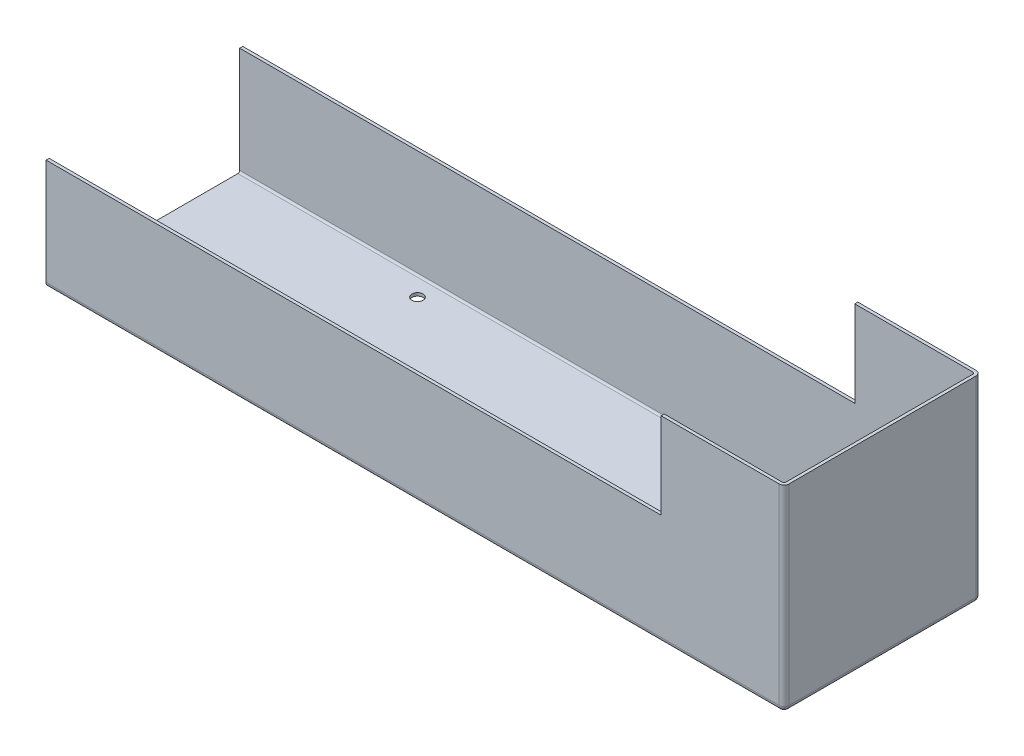
ISO-10303-21;
HEADER;
FILE_DESCRIPTION(('STEP AP214'),'2;1');
FILE_NAME('part.step','',(''),(''),'','','');
FILE_SCHEMA(('AUTOMOTIVE_DESIGN { 1 0 10303 214 1 1 1 1 }'));
ENDSEC;
DATA;
#1=APPLICATION_CONTEXT('core data for automotive mechanical design processes');
#2=APPLICATION_PROTOCOL_DEFINITION('international standard','automotive_design',2000,#1);
#3=PRODUCT_CONTEXT('',#1,'mechanical');
#4=PRODUCT('Part','Part','',(#3));
#5=PRODUCT_RELATED_PRODUCT_CATEGORY('part','',(#4));
#6=PRODUCT_DEFINITION_FORMATION('','',#4);
#7=PRODUCT_DEFINITION_CONTEXT('part definition',#1,'design');
#8=PRODUCT_DEFINITION('design','',#6,#7);
#9=PRODUCT_DEFINITION_SHAPE('','',#8);
#10=(LENGTH_UNIT() NAMED_UNIT(*) SI_UNIT(.MILLI.,.METRE.));
#11=(NAMED_UNIT(*) PLANE_ANGLE_UNIT() SI_UNIT($,.RADIAN.));
#12=(NAMED_UNIT(*) SI_UNIT($,.STERADIAN.) SOLID_ANGLE_UNIT());
#13=UNCERTAINTY_MEASURE_WITH_UNIT(LENGTH_MEASURE(1.E-05),#10,'distance_accuracy_value','');
#14=(GEOMETRIC_REPRESENTATION_CONTEXT(3) GLOBAL_UNCERTAINTY_ASSIGNED_CONTEXT((#13)) GLOBAL_UNIT_ASSIGNED_CONTEXT((#10,
#11,#12)) REPRESENTATION_CONTEXT('',''));
#15=CARTESIAN_POINT('',(0.,0.,0.));
#16=DIRECTION('',(0.,0.,1.));
#17=DIRECTION('',(1.,0.,0.));
#18=AXIS2_PLACEMENT_3D('',#15,#16,#17);
#19=CARTESIAN_POINT('',(298.,2.,38.));
#20=DIRECTION('',(1.,0.,0.));
#21=DIRECTION('',(0.,0.,-1.));
#22=AXIS2_PLACEMENT_3D('',#19,#20,#21);
#23=SPHERICAL_SURFACE('',#22,0.75);
#24=CARTESIAN_POINT('',(298.,2.,38.));
#25=DIRECTION('',(0.,0.,-1.));
#26=DIRECTION('',(-1.,0.,0.));
#27=AXIS2_PLACEMENT_3D('',#24,#25,#26);
#28=CIRCLE('',#27,0.749999999999973);
#29=CARTESIAN_POINT('',(298.75,2.,38.));
#30=VERTEX_POINT('',#29);
#31=CARTESIAN_POINT('',(298.,1.25000000000001,38.));
#32=VERTEX_POINT('',#31);
#33=EDGE_CURVE('E361',#30,#32,#28,.T.);
#34=ORIENTED_EDGE('',*,*,#33,.T.);
#35=CARTESIAN_POINT('',(298.,2.,38.));
#36=DIRECTION('',(-1.,0.,0.));
#37=DIRECTION('',(0.,0.,1.));
#38=AXIS2_PLACEMENT_3D('',#35,#36,#37);
#39=CIRCLE('',#38,0.750000000000001);
#40=CARTESIAN_POINT('',(298.,2.00000000000001,38.75));
#41=VERTEX_POINT('',#40);
#42=EDGE_CURVE('E112',#32,#41,#39,.T.);
#43=ORIENTED_EDGE('',*,*,#42,.T.);
#44=CARTESIAN_POINT('',(298.,2.,38.));
#45=DIRECTION('',(0.,-1.,0.));
#46=DIRECTION('',(0.,0.,-1.));
#47=AXIS2_PLACEMENT_3D('',#44,#45,#46);
#48=CIRCLE('',#47,0.750000000000001);
#49=EDGE_CURVE('E358',#41,#30,#48,.F.);
#50=ORIENTED_EDGE('',*,*,#49,.T.);
#51=EDGE_LOOP('',(#34,#43,#50));
#52=FACE_BOUND('',#51,.T.);
#53=ADVANCED_FACE('F16',(#52),#23,.F.);
#54=CARTESIAN_POINT('',(298.75,0.,40.));
#55=DIRECTION('',(-1.,0.,0.));
#56=DIRECTION('',(0.,0.,1.));
#57=AXIS2_PLACEMENT_3D('',#54,#55,#56);
#58=PLANE('',#57);
#59=DIRECTION('',(0.,0.,-1.));
#60=VECTOR('',#59,1.);
#61=CARTESIAN_POINT('',(298.75,2.,40.));
#62=LINE('',#61,#60);
#63=CARTESIAN_POINT('',(298.75,2.,-38.));
#64=VERTEX_POINT('',#63);
#65=EDGE_CURVE('E370',#64,#30,#62,.F.);
#66=ORIENTED_EDGE('',*,*,#65,.T.);
#67=DIRECTION('',(0.,-1.,0.));
#68=VECTOR('',#67,1.);
#69=CARTESIAN_POINT('',(298.75,0.,38.));
#70=LINE('',#69,#68);
#71=CARTESIAN_POINT('',(298.75,80.,38.));
#72=VERTEX_POINT('',#71);
#73=EDGE_CURVE('E342',#30,#72,#70,.F.);
#74=ORIENTED_EDGE('',*,*,#73,.T.);
#75=DIRECTION('',(0.,0.,-1.));
#76=VECTOR('',#75,1.);
#77=CARTESIAN_POINT('',(298.75,80.,40.));
#78=LINE('',#77,#76);
#79=CARTESIAN_POINT('',(298.75,80.,-38.));
#80=VERTEX_POINT('',#79);
#81=EDGE_CURVE('E307',#72,#80,#78,.T.);
#82=ORIENTED_EDGE('',*,*,#81,.T.);
#83=DIRECTION('',(0.,1.,0.));
#84=VECTOR('',#83,1.);
#85=CARTESIAN_POINT('',(298.75,0.,-38.));
#86=LINE('',#85,#84);
#87=EDGE_CURVE('E275',#80,#64,#86,.F.);
#88=ORIENTED_EDGE('',*,*,#87,.T.);
#89=EDGE_LOOP('',(#66,#74,#82,#88));
#90=FACE_BOUND('',#89,.T.);
#91=ADVANCED_FACE('F390',(#90),#58,.T.);
#92=CARTESIAN_POINT('',(298.,2.,-38.));
#93=DIRECTION('',(1.,0.,0.));
#94=DIRECTION('',(0.,0.,-1.));
#95=AXIS2_PLACEMENT_3D('',#92,#93,#94);
#96=SPHERICAL_SURFACE('',#95,0.75);
#97=CARTESIAN_POINT('',(298.,2.,-38.));
#98=DIRECTION('',(0.,0.,-1.));
#99=DIRECTION('',(-1.,0.,0.));
#100=AXIS2_PLACEMENT_3D('',#97,#98,#99);
#101=CIRCLE('',#100,0.749999999999973);
#102=CARTESIAN_POINT('',(298.,1.25000000000001,-38.));
#103=VERTEX_POINT('',#102);
#104=EDGE_CURVE('E367',#103,#64,#101,.F.);
#105=ORIENTED_EDGE('',*,*,#104,.T.);
#106=CARTESIAN_POINT('',(298.,2.,-38.));
#107=DIRECTION('',(0.,1.,0.));
#108=DIRECTION('',(0.,0.,1.));
#109=AXIS2_PLACEMENT_3D('',#106,#107,#108);
#110=CIRCLE('',#109,0.750000000000001);
#111=CARTESIAN_POINT('',(298.,2.00000000000001,-38.75));
#112=VERTEX_POINT('',#111);
#113=EDGE_CURVE('E272',#64,#112,#110,.T.);
#114=ORIENTED_EDGE('',*,*,#113,.T.);
#115=CARTESIAN_POINT('',(298.,2.,-38.));
#116=DIRECTION('',(1.,0.,0.));
#117=DIRECTION('',(0.,0.,-1.));
#118=AXIS2_PLACEMENT_3D('',#115,#116,#117);
#119=CIRCLE('',#118,0.750000000000001);
#120=EDGE_CURVE('E265',#112,#103,#119,.F.);
#121=ORIENTED_EDGE('',*,*,#120,.T.);
#122=EDGE_LOOP('',(#105,#114,#121));
#123=FACE_BOUND('',#122,.T.);
#124=ADVANCED_FACE('F386',(#123),#96,.F.);
#125=CARTESIAN_POINT('',(298.,2.,40.));
#126=DIRECTION('',(0.,0.,-1.));
#127=DIRECTION('',(-1.,0.,0.));
#128=AXIS2_PLACEMENT_3D('',#125,#126,#127);
#129=CYLINDRICAL_SURFACE('',#128,0.749999999999973);
#130=ORIENTED_EDGE('',*,*,#65,.F.);
#131=ORIENTED_EDGE('',*,*,#104,.F.);
#132=DIRECTION('',(0.,0.,1.));
#133=VECTOR('',#132,1.);
#134=CARTESIAN_POINT('',(298.,1.25,40.));
#135=LINE('',#134,#133);
#136=EDGE_CURVE('E121',#32,#103,#135,.F.);
#137=ORIENTED_EDGE('',*,*,#136,.F.);
#138=ORIENTED_EDGE('',*,*,#33,.F.);
#139=EDGE_LOOP('',(#130,#131,#137,#138));
#140=FACE_BOUND('',#139,.T.);
#141=ADVANCED_FACE('F389',(#140),#129,.F.);
#142=CARTESIAN_POINT('',(298.,0.,38.));
#143=DIRECTION('',(0.,-1.,0.));
#144=DIRECTION('',(0.,0.,-1.));
#145=AXIS2_PLACEMENT_3D('',#142,#143,#144);
#146=CYLINDRICAL_SURFACE('',#145,0.750000000000001);
#147=ORIENTED_EDGE('',*,*,#73,.F.);
#148=ORIENTED_EDGE('',*,*,#49,.F.);
#149=DIRECTION('',(0.,1.,0.));
#150=VECTOR('',#149,1.);
#151=CARTESIAN_POINT('',(298.,0.,38.75));
#152=LINE('',#151,#150);
#153=CARTESIAN_POINT('',(298.,80.,38.75));
#154=VERTEX_POINT('',#153);
#155=EDGE_CURVE('E217',#41,#154,#152,.T.);
#156=ORIENTED_EDGE('',*,*,#155,.T.);
#157=CARTESIAN_POINT('',(298.,80.,38.));
#158=DIRECTION('',(0.,-1.,0.));
#159=DIRECTION('',(0.,0.,-1.));
#160=AXIS2_PLACEMENT_3D('',#157,#158,#159);
#161=CIRCLE('',#160,0.750000000000001);
#162=EDGE_CURVE('E299',#154,#72,#161,.F.);
#163=ORIENTED_EDGE('',*,*,#162,.T.);
#164=EDGE_LOOP('',(#147,#148,#156,#163));
#165=FACE_BOUND('',#164,.T.);
#166=ADVANCED_FACE('F560',(#165),#146,.F.);
#167=CARTESIAN_POINT('',(0.,2.,38.));
#168=DIRECTION('',(-1.,0.,0.));
#169=DIRECTION('',(0.,0.,1.));
#170=AXIS2_PLACEMENT_3D('',#167,#168,#169);
#171=CYLINDRICAL_SURFACE('',#170,0.750000000000001);
#172=DIRECTION('',(1.,0.,0.));
#173=VECTOR('',#172,1.);
#174=CARTESIAN_POINT('',(0.,2.00000000000002,38.75));
#175=LINE('',#174,#173);
#176=CARTESIAN_POINT('',(0.,2.00000000000001,38.75));
#177=VERTEX_POINT('',#176);
#178=EDGE_CURVE('E205',#177,#41,#175,.T.);
#179=ORIENTED_EDGE('',*,*,#178,.T.);
#180=ORIENTED_EDGE('',*,*,#42,.F.);
#181=DIRECTION('',(1.,0.,0.));
#182=VECTOR('',#181,1.);
#183=CARTESIAN_POINT('',(0.,1.25,38.));
#184=LINE('',#183,#182);
#185=CARTESIAN_POINT('',(0.,1.25,38.));
#186=VERTEX_POINT('',#185);
#187=EDGE_CURVE('E115',#186,#32,#184,.T.);
#188=ORIENTED_EDGE('',*,*,#187,.F.);
#189=CARTESIAN_POINT('',(0.,2.,38.));
#190=DIRECTION('',(-1.,0.,0.));
#191=DIRECTION('',(0.,0.,1.));
#192=AXIS2_PLACEMENT_3D('',#189,#190,#191);
#193=CIRCLE('',#192,0.750000000000001);
#194=EDGE_CURVE('E20',#177,#186,#193,.F.);
#195=ORIENTED_EDGE('',*,*,#194,.F.);
#196=EDGE_LOOP('',(#179,#180,#188,#195));
#197=FACE_BOUND('',#196,.T.);
#198=ADVANCED_FACE('F116',(#197),#171,.F.);
#199=CARTESIAN_POINT('',(298.,0.,38.));
#200=DIRECTION('',(0.,-1.,0.));
#201=DIRECTION('',(0.,0.,-1.));
#202=AXIS2_PLACEMENT_3D('',#199,#200,#201);
#203=CYLINDRICAL_SURFACE('',#202,2.);
#204=CARTESIAN_POINT('',(298.,2.,38.));
#205=DIRECTION('',(0.,-1.,0.));
#206=DIRECTION('',(1.,0.,0.));
#207=AXIS2_PLACEMENT_3D('',#204,#205,#206);
#208=CIRCLE('',#207,2.);
#209=CARTESIAN_POINT('',(300.,2.,38.));
#210=VERTEX_POINT('',#209);
#211=CARTESIAN_POINT('',(298.,2.,40.));
#212=VERTEX_POINT('',#211);
#213=EDGE_CURVE('E248',#210,#212,#208,.T.);
#214=ORIENTED_EDGE('',*,*,#213,.F.);
#215=DIRECTION('',(0.,1.,0.));
#216=VECTOR('',#215,1.);
#217=CARTESIAN_POINT('',(300.,0.,38.));
#218=LINE('',#217,#216);
#219=CARTESIAN_POINT('',(300.,80.,38.));
#220=VERTEX_POINT('',#219);
#221=EDGE_CURVE('E255',#210,#220,#218,.T.);
#222=ORIENTED_EDGE('',*,*,#221,.T.);
#223=CARTESIAN_POINT('',(298.,80.,38.));
#224=DIRECTION('',(0.,-1.,0.));
#225=DIRECTION('',(0.,0.,-1.));
#226=AXIS2_PLACEMENT_3D('',#223,#224,#225);
#227=CIRCLE('',#226,2.);
#228=CARTESIAN_POINT('',(298.,80.,40.));
#229=VERTEX_POINT('',#228);
#230=EDGE_CURVE('E338',#220,#229,#227,.T.);
#231=ORIENTED_EDGE('',*,*,#230,.T.);
#232=DIRECTION('',(0.,1.,0.));
#233=VECTOR('',#232,1.);
#234=CARTESIAN_POINT('',(298.,0.,40.));
#235=LINE('',#234,#233);
#236=EDGE_CURVE('E207',#212,#229,#235,.T.);
#237=ORIENTED_EDGE('',*,*,#236,.F.);
#238=EDGE_LOOP('',(#214,#222,#231,#237));
#239=FACE_BOUND('',#238,.T.);
#240=ADVANCED_FACE('F512',(#239),#203,.T.);
#241=CARTESIAN_POINT('',(250.,80.,40.));
#242=DIRECTION('',(1.,0.,0.));
#243=DIRECTION('',(0.,0.,-1.));
#244=AXIS2_PLACEMENT_3D('',#241,#242,#243);
#245=PLANE('',#244);
#246=DIRECTION('',(0.,1.,0.));
#247=VECTOR('',#246,1.);
#248=CARTESIAN_POINT('',(250.,0.,38.75));
#249=LINE('',#248,#247);
#250=CARTESIAN_POINT('',(250.,80.,38.75));
#251=VERTEX_POINT('',#250);
#252=CARTESIAN_POINT('',(250.,45.,38.75));
#253=VERTEX_POINT('',#252);
#254=EDGE_CURVE('E213',#251,#253,#249,.F.);
#255=ORIENTED_EDGE('',*,*,#254,.T.);
#256=DIRECTION('',(0.,0.,1.));
#257=VECTOR('',#256,1.);
#258=CARTESIAN_POINT('',(250.,45.,40.));
#259=LINE('',#258,#257);
#260=CARTESIAN_POINT('',(250.,45.,40.));
#261=VERTEX_POINT('',#260);
#262=EDGE_CURVE('E311',#253,#261,#259,.T.);
#263=ORIENTED_EDGE('',*,*,#262,.T.);
#264=DIRECTION('',(0.,1.,0.));
#265=VECTOR('',#264,1.);
#266=CARTESIAN_POINT('',(250.,0.,40.));
#267=LINE('',#266,#265);
#268=CARTESIAN_POINT('',(250.,80.,40.));
#269=VERTEX_POINT('',#268);
#270=EDGE_CURVE('E202',#269,#261,#267,.F.);
#271=ORIENTED_EDGE('',*,*,#270,.F.);
#272=DIRECTION('',(0.,0.,-1.));
#273=VECTOR('',#272,1.);
#274=CARTESIAN_POINT('',(250.,80.,40.));
#275=LINE('',#274,#273);
#276=EDGE_CURVE('E335',#269,#251,#275,.T.);
#277=ORIENTED_EDGE('',*,*,#276,.T.);
#278=EDGE_LOOP('',(#255,#263,#271,#277));
#279=FACE_BOUND('',#278,.T.);
#280=ADVANCED_FACE('F559',(#279),#245,.F.);
#281=CARTESIAN_POINT('',(250.,45.,40.));
#282=DIRECTION('',(0.,-1.,0.));
#283=DIRECTION('',(1.,0.,0.));
#284=AXIS2_PLACEMENT_3D('',#281,#282,#283);
#285=PLANE('',#284);
#286=DIRECTION('',(1.,0.,0.));
#287=VECTOR('',#286,1.);
#288=CARTESIAN_POINT('',(0.,45.,38.75));
#289=LINE('',#288,#287);
#290=CARTESIAN_POINT('',(0.,45.,38.75));
#291=VERTEX_POINT('',#290);
#292=EDGE_CURVE('E208',#253,#291,#289,.F.);
#293=ORIENTED_EDGE('',*,*,#292,.T.);
#294=DIRECTION('',(0.,0.,1.));
#295=VECTOR('',#294,1.);
#296=CARTESIAN_POINT('',(0.,45.,40.));
#297=LINE('',#296,#295);
#298=CARTESIAN_POINT('',(0.,45.,40.));
#299=VERTEX_POINT('',#298);
#300=EDGE_CURVE('E111',#299,#291,#297,.F.);
#301=ORIENTED_EDGE('',*,*,#300,.F.);
#302=DIRECTION('',(1.,0.,0.));
#303=VECTOR('',#302,1.);
#304=CARTESIAN_POINT('',(0.,45.,40.));
#305=LINE('',#304,#303);
#306=EDGE_CURVE('E199',#261,#299,#305,.F.);
#307=ORIENTED_EDGE('',*,*,#306,.F.);
#308=ORIENTED_EDGE('',*,*,#262,.F.);
#309=EDGE_LOOP('',(#293,#301,#307,#308));
#310=FACE_BOUND('',#309,.T.);
#311=ADVANCED_FACE('F555',(#310),#285,.F.);
#312=CARTESIAN_POINT('',(298.,0.,-38.));
#313=DIRECTION('',(0.,1.,0.));
#314=DIRECTION('',(0.,0.,1.));
#315=AXIS2_PLACEMENT_3D('',#312,#313,#314);
#316=CYLINDRICAL_SURFACE('',#315,2.);
#317=CARTESIAN_POINT('',(298.,2.,-38.));
#318=DIRECTION('',(0.,1.,0.));
#319=DIRECTION('',(1.,0.,0.));
#320=AXIS2_PLACEMENT_3D('',#317,#318,#319);
#321=CIRCLE('',#320,2.);
#322=CARTESIAN_POINT('',(298.,2.,-40.));
#323=VERTEX_POINT('',#322);
#324=CARTESIAN_POINT('',(300.,2.,-38.));
#325=VERTEX_POINT('',#324);
#326=EDGE_CURVE('E122',#323,#325,#321,.F.);
#327=ORIENTED_EDGE('',*,*,#326,.F.);
#328=DIRECTION('',(0.,1.,0.));
#329=VECTOR('',#328,1.);
#330=CARTESIAN_POINT('',(298.,0.,-40.));
#331=LINE('',#330,#329);
#332=CARTESIAN_POINT('',(298.,80.,-40.));
#333=VERTEX_POINT('',#332);
#334=EDGE_CURVE('E188',#323,#333,#331,.T.);
#335=ORIENTED_EDGE('',*,*,#334,.T.);
#336=CARTESIAN_POINT('',(298.,80.,-38.));
#337=DIRECTION('',(0.,1.,0.));
#338=DIRECTION('',(0.,0.,1.));
#339=AXIS2_PLACEMENT_3D('',#336,#337,#338);
#340=CIRCLE('',#339,2.);
#341=CARTESIAN_POINT('',(300.,80.,-38.));
#342=VERTEX_POINT('',#341);
#343=EDGE_CURVE('E310',#333,#342,#340,.F.);
#344=ORIENTED_EDGE('',*,*,#343,.T.);
#345=DIRECTION('',(0.,1.,0.));
#346=VECTOR('',#345,1.);
#347=CARTESIAN_POINT('',(300.,0.,-38.));
#348=LINE('',#347,#346);
#349=EDGE_CURVE('E251',#342,#325,#348,.F.);
#350=ORIENTED_EDGE('',*,*,#349,.T.);
#351=EDGE_LOOP('',(#327,#335,#344,#350));
#352=FACE_BOUND('',#351,.T.);
#353=ADVANCED_FACE('F499',(#352),#316,.T.);
#354=CARTESIAN_POINT('',(300.,80.,40.));
#355=DIRECTION('',(0.,-1.,0.));
#356=DIRECTION('',(0.,0.,-1.));
#357=AXIS2_PLACEMENT_3D('',#354,#355,#356);
#358=PLANE('',#357);
#359=DIRECTION('',(1.,0.,0.));
#360=VECTOR('',#359,1.);
#361=CARTESIAN_POINT('',(0.,80.,38.75));
#362=LINE('',#361,#360);
#363=EDGE_CURVE('E347',#154,#251,#362,.F.);
#364=ORIENTED_EDGE('',*,*,#363,.T.);
#365=ORIENTED_EDGE('',*,*,#276,.F.);
#366=DIRECTION('',(1.,0.,0.));
#367=VECTOR('',#366,1.);
#368=CARTESIAN_POINT('',(0.,80.,40.));
#369=LINE('',#368,#367);
#370=EDGE_CURVE('E262',#229,#269,#369,.F.);
#371=ORIENTED_EDGE('',*,*,#370,.F.);
#372=ORIENTED_EDGE('',*,*,#230,.F.);
#373=DIRECTION('',(0.,0.,1.));
#374=VECTOR('',#373,1.);
#375=CARTESIAN_POINT('',(300.,80.,40.));
#376=LINE('',#375,#374);
#377=EDGE_CURVE('E258',#220,#342,#376,.F.);
#378=ORIENTED_EDGE('',*,*,#377,.T.);
#379=ORIENTED_EDGE('',*,*,#343,.F.);
#380=DIRECTION('',(1.,0.,0.));
#381=VECTOR('',#380,1.);
#382=CARTESIAN_POINT('',(0.,80.,-40.));
#383=LINE('',#382,#381);
#384=CARTESIAN_POINT('',(250.,80.,-40.));
#385=VERTEX_POINT('',#384);
#386=EDGE_CURVE('E304',#333,#385,#383,.F.);
#387=ORIENTED_EDGE('',*,*,#386,.T.);
#388=DIRECTION('',(0.,0.,-1.));
#389=VECTOR('',#388,1.);
#390=CARTESIAN_POINT('',(250.,80.,40.));
#391=LINE('',#390,#389);
#392=CARTESIAN_POINT('',(250.,80.,-38.75));
#393=VERTEX_POINT('',#392);
#394=EDGE_CURVE('E285',#385,#393,#391,.F.);
#395=ORIENTED_EDGE('',*,*,#394,.T.);
#396=DIRECTION('',(1.,0.,0.));
#397=VECTOR('',#396,1.);
#398=CARTESIAN_POINT('',(0.,80.,-38.75));
#399=LINE('',#398,#397);
#400=CARTESIAN_POINT('',(298.,80.,-38.75));
#401=VERTEX_POINT('',#400);
#402=EDGE_CURVE('E294',#401,#393,#399,.F.);
#403=ORIENTED_EDGE('',*,*,#402,.F.);
#404=CARTESIAN_POINT('',(298.,80.,-38.));
#405=DIRECTION('',(0.,1.,0.));
#406=DIRECTION('',(0.,0.,1.));
#407=AXIS2_PLACEMENT_3D('',#404,#405,#406);
#408=CIRCLE('',#407,0.750000000000001);
#409=EDGE_CURVE('E252',#401,#80,#408,.F.);
#410=ORIENTED_EDGE('',*,*,#409,.T.);
#411=ORIENTED_EDGE('',*,*,#81,.F.);
#412=ORIENTED_EDGE('',*,*,#162,.F.);
#413=EDGE_LOOP('',(#364,#365,#371,#372,#378,#379,#387,#395,#403,#410,#411,#412));
#414=FACE_BOUND('',#413,.T.);
#415=ADVANCED_FACE('F506',(#414),#358,.F.);
#416=CARTESIAN_POINT('',(250.,80.,40.));
#417=DIRECTION('',(1.,0.,0.));
#418=DIRECTION('',(0.,0.,-1.));
#419=AXIS2_PLACEMENT_3D('',#416,#417,#418);
#420=PLANE('',#419);
#421=ORIENTED_EDGE('',*,*,#394,.F.);
#422=DIRECTION('',(0.,1.,0.));
#423=VECTOR('',#422,1.);
#424=CARTESIAN_POINT('',(250.,0.,-40.));
#425=LINE('',#424,#423);
#426=CARTESIAN_POINT('',(250.,45.,-40.));
#427=VERTEX_POINT('',#426);
#428=EDGE_CURVE('E189',#385,#427,#425,.F.);
#429=ORIENTED_EDGE('',*,*,#428,.T.);
#430=DIRECTION('',(0.,0.,1.));
#431=VECTOR('',#430,1.);
#432=CARTESIAN_POINT('',(250.,45.,40.));
#433=LINE('',#432,#431);
#434=CARTESIAN_POINT('',(250.,45.,-38.75));
#435=VERTEX_POINT('',#434);
#436=EDGE_CURVE('E269',#427,#435,#433,.T.);
#437=ORIENTED_EDGE('',*,*,#436,.T.);
#438=DIRECTION('',(0.,1.,0.));
#439=VECTOR('',#438,1.);
#440=CARTESIAN_POINT('',(250.,0.,-38.75));
#441=LINE('',#440,#439);
#442=EDGE_CURVE('E182',#393,#435,#441,.F.);
#443=ORIENTED_EDGE('',*,*,#442,.F.);
#444=EDGE_LOOP('',(#421,#429,#437,#443));
#445=FACE_BOUND('',#444,.T.);
#446=ADVANCED_FACE('F578',(#445),#420,.F.);
#447=CARTESIAN_POINT('',(250.,45.,40.));
#448=DIRECTION('',(0.,-1.,0.));
#449=DIRECTION('',(1.,0.,0.));
#450=AXIS2_PLACEMENT_3D('',#447,#448,#449);
#451=PLANE('',#450);
#452=ORIENTED_EDGE('',*,*,#436,.F.);
#453=DIRECTION('',(1.,0.,0.));
#454=VECTOR('',#453,1.);
#455=CARTESIAN_POINT('',(0.,45.,-40.));
#456=LINE('',#455,#454);
#457=CARTESIAN_POINT('',(0.,45.,-40.));
#458=VERTEX_POINT('',#457);
#459=EDGE_CURVE('E185',#427,#458,#456,.F.);
#460=ORIENTED_EDGE('',*,*,#459,.T.);
#461=DIRECTION('',(0.,0.,1.));
#462=VECTOR('',#461,1.);
#463=CARTESIAN_POINT('',(0.,45.,40.));
#464=LINE('',#463,#462);
#465=CARTESIAN_POINT('',(0.,45.,-38.75));
#466=VERTEX_POINT('',#465);
#467=EDGE_CURVE('E283',#466,#458,#464,.F.);
#468=ORIENTED_EDGE('',*,*,#467,.F.);
#469=DIRECTION('',(1.,0.,0.));
#470=VECTOR('',#469,1.);
#471=CARTESIAN_POINT('',(0.,45.,-38.75));
#472=LINE('',#471,#470);
#473=EDGE_CURVE('E177',#435,#466,#472,.F.);
#474=ORIENTED_EDGE('',*,*,#473,.F.);
#475=EDGE_LOOP('',(#452,#460,#468,#474));
#476=FACE_BOUND('',#475,.T.);
#477=ADVANCED_FACE('F581',(#476),#451,.F.);
#478=CARTESIAN_POINT('',(0.,2.,-38.));
#479=DIRECTION('',(1.,0.,0.));
#480=DIRECTION('',(0.,0.,-1.));
#481=AXIS2_PLACEMENT_3D('',#478,#479,#480);
#482=CYLINDRICAL_SURFACE('',#481,0.750000000000001);
#483=DIRECTION('',(1.,0.,0.));
#484=VECTOR('',#483,1.);
#485=CARTESIAN_POINT('',(0.,1.25,-38.));
#486=LINE('',#485,#484);
#487=CARTESIAN_POINT('',(0.,1.25,-38.));
#488=VERTEX_POINT('',#487);
#489=EDGE_CURVE('E128',#103,#488,#486,.F.);
#490=ORIENTED_EDGE('',*,*,#489,.F.);
#491=ORIENTED_EDGE('',*,*,#120,.F.);
#492=DIRECTION('',(1.,0.,0.));
#493=VECTOR('',#492,1.);
#494=CARTESIAN_POINT('',(0.,2.00000000000002,-38.75));
#495=LINE('',#494,#493);
#496=CARTESIAN_POINT('',(0.,2.00000000000001,-38.75));
#497=VERTEX_POINT('',#496);
#498=EDGE_CURVE('E173',#497,#112,#495,.T.);
#499=ORIENTED_EDGE('',*,*,#498,.F.);
#500=CARTESIAN_POINT('',(0.,2.,-38.));
#501=DIRECTION('',(1.,0.,0.));
#502=DIRECTION('',(0.,0.,-1.));
#503=AXIS2_PLACEMENT_3D('',#500,#501,#502);
#504=CIRCLE('',#503,0.750000000000001);
#505=EDGE_CURVE('E268',#488,#497,#504,.T.);
#506=ORIENTED_EDGE('',*,*,#505,.F.);
#507=EDGE_LOOP('',(#490,#491,#499,#506));
#508=FACE_BOUND('',#507,.T.);
#509=ADVANCED_FACE('F484',(#508),#482,.F.);
#510=CARTESIAN_POINT('',(298.,0.,-38.));
#511=DIRECTION('',(0.,1.,0.));
#512=DIRECTION('',(0.,0.,1.));
#513=AXIS2_PLACEMENT_3D('',#510,#511,#512);
#514=CYLINDRICAL_SURFACE('',#513,0.750000000000001);
#515=DIRECTION('',(0.,1.,0.));
#516=VECTOR('',#515,1.);
#517=CARTESIAN_POINT('',(298.,0.,-38.75));
#518=LINE('',#517,#516);
#519=EDGE_CURVE('E176',#112,#401,#518,.T.);
#520=ORIENTED_EDGE('',*,*,#519,.F.);
#521=ORIENTED_EDGE('',*,*,#113,.F.);
#522=ORIENTED_EDGE('',*,*,#87,.F.);
#523=ORIENTED_EDGE('',*,*,#409,.F.);
#524=EDGE_LOOP('',(#520,#521,#522,#523));
#525=FACE_BOUND('',#524,.T.);
#526=ADVANCED_FACE('F240',(#525),#514,.F.);
#527=CARTESIAN_POINT('',(298.,2.,38.));
#528=DIRECTION('',(1.,0.,0.));
#529=DIRECTION('',(0.,0.,-1.));
#530=AXIS2_PLACEMENT_3D('',#527,#528,#529);
#531=SPHERICAL_SURFACE('',#530,2.);
#532=CARTESIAN_POINT('',(298.,2.,38.));
#533=DIRECTION('',(-1.,0.,0.));
#534=DIRECTION('',(0.,0.,1.));
#535=AXIS2_PLACEMENT_3D('',#532,#533,#534);
#536=CIRCLE('',#535,2.);
#537=CARTESIAN_POINT('',(298.,0.,38.));
#538=VERTEX_POINT('',#537);
#539=EDGE_CURVE('E167',#538,#212,#536,.T.);
#540=ORIENTED_EDGE('',*,*,#539,.F.);
#541=CARTESIAN_POINT('',(298.,2.,38.));
#542=DIRECTION('',(0.,0.,-1.));
#543=DIRECTION('',(-1.,0.,0.));
#544=AXIS2_PLACEMENT_3D('',#541,#542,#543);
#545=CIRCLE('',#544,2.);
#546=EDGE_CURVE('E159',#210,#538,#545,.T.);
#547=ORIENTED_EDGE('',*,*,#546,.F.);
#548=ORIENTED_EDGE('',*,*,#213,.T.);
#549=EDGE_LOOP('',(#540,#547,#548));
#550=FACE_BOUND('',#549,.T.);
#551=ADVANCED_FACE('F235',(#550),#531,.T.);
#552=CARTESIAN_POINT('',(300.,0.,40.));
#553=DIRECTION('',(-1.,0.,0.));
#554=DIRECTION('',(0.,0.,1.));
#555=AXIS2_PLACEMENT_3D('',#552,#553,#554);
#556=PLANE('',#555);
#557=ORIENTED_EDGE('',*,*,#221,.F.);
#558=DIRECTION('',(0.,0.,-1.));
#559=VECTOR('',#558,1.);
#560=CARTESIAN_POINT('',(300.,2.,40.));
#561=LINE('',#560,#559);
#562=EDGE_CURVE('E158',#325,#210,#561,.F.);
#563=ORIENTED_EDGE('',*,*,#562,.F.);
#564=ORIENTED_EDGE('',*,*,#349,.F.);
#565=ORIENTED_EDGE('',*,*,#377,.F.);
#566=EDGE_LOOP('',(#557,#563,#564,#565));
#567=FACE_BOUND('',#566,.T.);
#568=ADVANCED_FACE('F230',(#567),#556,.F.);
#569=CARTESIAN_POINT('',(298.,2.,-38.));
#570=DIRECTION('',(1.,0.,0.));
#571=DIRECTION('',(0.,0.,-1.));
#572=AXIS2_PLACEMENT_3D('',#569,#570,#571);
#573=SPHERICAL_SURFACE('',#572,2.);
#574=ORIENTED_EDGE('',*,*,#326,.T.);
#575=CARTESIAN_POINT('',(298.,2.,-38.));
#576=DIRECTION('',(0.,0.,-1.));
#577=DIRECTION('',(-1.,0.,0.));
#578=AXIS2_PLACEMENT_3D('',#575,#576,#577);
#579=CIRCLE('',#578,2.);
#580=CARTESIAN_POINT('',(298.,0.,-38.));
#581=VERTEX_POINT('',#580);
#582=EDGE_CURVE('E155',#581,#325,#579,.F.);
#583=ORIENTED_EDGE('',*,*,#582,.F.);
#584=CARTESIAN_POINT('',(298.,2.,-38.));
#585=DIRECTION('',(1.,0.,0.));
#586=DIRECTION('',(0.,0.,-1.));
#587=AXIS2_PLACEMENT_3D('',#584,#585,#586);
#588=CIRCLE('',#587,2.);
#589=EDGE_CURVE('E129',#323,#581,#588,.F.);
#590=ORIENTED_EDGE('',*,*,#589,.F.);
#591=EDGE_LOOP('',(#574,#583,#590));
#592=FACE_BOUND('',#591,.T.);
#593=ADVANCED_FACE('F226',(#592),#573,.T.);
#594=CARTESIAN_POINT('',(0.,1.25,40.));
#595=DIRECTION('',(0.,1.,0.));
#596=DIRECTION('',(0.,0.,1.));
#597=AXIS2_PLACEMENT_3D('',#594,#595,#596);
#598=PLANE('',#597);
#599=ORIENTED_EDGE('',*,*,#136,.T.);
#600=ORIENTED_EDGE('',*,*,#489,.T.);
#601=DIRECTION('',(0.,0.,1.));
#602=VECTOR('',#601,1.);
#603=CARTESIAN_POINT('',(0.,1.25,40.));
#604=LINE('',#603,#602);
#605=EDGE_CURVE('E108',#488,#186,#604,.T.);
#606=ORIENTED_EDGE('',*,*,#605,.T.);
#607=ORIENTED_EDGE('',*,*,#187,.T.);
#608=EDGE_LOOP('',(#599,#600,#606,#607));
#609=FACE_BOUND('',#608,.T.);
#610=CARTESIAN_POINT('',(200.,1.25,-31.));
#611=DIRECTION('',(0.,-1.,0.));
#612=DIRECTION('',(0.,0.,-1.));
#613=AXIS2_PLACEMENT_3D('',#610,#611,#612);
#614=CIRCLE('',#613,2.25);
#615=CARTESIAN_POINT('',(200.,1.25,-33.25));
#616=VERTEX_POINT('',#615);
#617=EDGE_CURVE('E170',#616,#616,#614,.T.);
#618=ORIENTED_EDGE('',*,*,#617,.T.);
#619=EDGE_LOOP('',(#618));
#620=FACE_BOUND('',#619,.T.);
#621=CARTESIAN_POINT('',(200.,1.25,31.));
#622=DIRECTION('',(0.,-1.,0.));
#623=DIRECTION('',(0.,0.,-1.));
#624=AXIS2_PLACEMENT_3D('',#621,#622,#623);
#625=CIRCLE('',#624,2.25);
#626=CARTESIAN_POINT('',(200.,1.25,28.75));
#627=VERTEX_POINT('',#626);
#628=EDGE_CURVE('E835',#627,#627,#625,.T.);
#629=ORIENTED_EDGE('',*,*,#628,.T.);
#630=EDGE_LOOP('',(#629));
#631=FACE_BOUND('',#630,.T.);
#632=CARTESIAN_POINT('',(80.,1.25,-31.));
#633=DIRECTION('',(0.,-1.,0.));
#634=DIRECTION('',(0.,0.,-1.));
#635=AXIS2_PLACEMENT_3D('',#632,#633,#634);
#636=CIRCLE('',#635,2.25);
#637=CARTESIAN_POINT('',(80.,1.25,-33.25));
#638=VERTEX_POINT('',#637);
#639=EDGE_CURVE('E838',#638,#638,#636,.T.);
#640=ORIENTED_EDGE('',*,*,#639,.T.);
#641=EDGE_LOOP('',(#640));
#642=FACE_BOUND('',#641,.T.);
#643=CARTESIAN_POINT('',(80.,1.25,31.));
#644=DIRECTION('',(0.,-1.,0.));
#645=DIRECTION('',(0.,0.,-1.));
#646=AXIS2_PLACEMENT_3D('',#643,#644,#645);
#647=CIRCLE('',#646,2.25);
#648=CARTESIAN_POINT('',(80.,1.25,28.75));
#649=VERTEX_POINT('',#648);
#650=EDGE_CURVE('E280',#649,#649,#647,.T.);
#651=ORIENTED_EDGE('',*,*,#650,.T.);
#652=EDGE_LOOP('',(#651));
#653=FACE_BOUND('',#652,.T.);
#654=ADVANCED_FACE('F125',(#609,#620,#631,#642,#653),#598,.T.);
#655=CARTESIAN_POINT('',(0.,0.,38.75));
#656=DIRECTION('',(0.,0.,1.));
#657=DIRECTION('',(1.,0.,0.));
#658=AXIS2_PLACEMENT_3D('',#655,#656,#657);
#659=PLANE('',#658);
#660=DIRECTION('',(0.,1.,0.));
#661=VECTOR('',#660,1.);
#662=CARTESIAN_POINT('',(0.,45.,38.75));
#663=LINE('',#662,#661);
#664=EDGE_CURVE('E110',#177,#291,#663,.T.);
#665=ORIENTED_EDGE('',*,*,#664,.T.);
#666=ORIENTED_EDGE('',*,*,#292,.F.);
#667=ORIENTED_EDGE('',*,*,#254,.F.);
#668=ORIENTED_EDGE('',*,*,#363,.F.);
#669=ORIENTED_EDGE('',*,*,#155,.F.);
#670=ORIENTED_EDGE('',*,*,#178,.F.);
#671=EDGE_LOOP('',(#665,#666,#667,#668,#669,#670));
#672=FACE_BOUND('',#671,.T.);
#673=ADVANCED_FACE('F450',(#672),#659,.F.);
#674=CARTESIAN_POINT('',(0.,0.,40.));
#675=DIRECTION('',(0.,0.,1.));
#676=DIRECTION('',(1.,0.,0.));
#677=AXIS2_PLACEMENT_3D('',#674,#675,#676);
#678=PLANE('',#677);
#679=ORIENTED_EDGE('',*,*,#306,.T.);
#680=DIRECTION('',(0.,1.,0.));
#681=VECTOR('',#680,1.);
#682=CARTESIAN_POINT('',(0.,45.,40.));
#683=LINE('',#682,#681);
#684=CARTESIAN_POINT('',(0.,2.,40.));
#685=VERTEX_POINT('',#684);
#686=EDGE_CURVE('E131',#299,#685,#683,.F.);
#687=ORIENTED_EDGE('',*,*,#686,.T.);
#688=DIRECTION('',(-1.,0.,0.));
#689=VECTOR('',#688,1.);
#690=CARTESIAN_POINT('',(0.,2.,40.));
#691=LINE('',#690,#689);
#692=EDGE_CURVE('E164',#212,#685,#691,.T.);
#693=ORIENTED_EDGE('',*,*,#692,.F.);
#694=ORIENTED_EDGE('',*,*,#236,.T.);
#695=ORIENTED_EDGE('',*,*,#370,.T.);
#696=ORIENTED_EDGE('',*,*,#270,.T.);
#697=EDGE_LOOP('',(#679,#687,#693,#694,#695,#696));
#698=FACE_BOUND('',#697,.T.);
#699=ADVANCED_FACE('F447',(#698),#678,.T.);
#700=CARTESIAN_POINT('',(0.,0.,-40.));
#701=DIRECTION('',(0.,0.,1.));
#702=DIRECTION('',(1.,0.,0.));
#703=AXIS2_PLACEMENT_3D('',#700,#701,#702);
#704=PLANE('',#703);
#705=ORIENTED_EDGE('',*,*,#334,.F.);
#706=DIRECTION('',(1.,0.,0.));
#707=VECTOR('',#706,1.);
#708=CARTESIAN_POINT('',(0.,2.,-40.));
#709=LINE('',#708,#707);
#710=CARTESIAN_POINT('',(0.,2.,-40.));
#711=VERTEX_POINT('',#710);
#712=EDGE_CURVE('E133',#711,#323,#709,.T.);
#713=ORIENTED_EDGE('',*,*,#712,.F.);
#714=DIRECTION('',(0.,1.,0.));
#715=VECTOR('',#714,1.);
#716=CARTESIAN_POINT('',(0.,45.,-40.));
#717=LINE('',#716,#715);
#718=EDGE_CURVE('E814',#711,#458,#717,.T.);
#719=ORIENTED_EDGE('',*,*,#718,.T.);
#720=ORIENTED_EDGE('',*,*,#459,.F.);
#721=ORIENTED_EDGE('',*,*,#428,.F.);
#722=ORIENTED_EDGE('',*,*,#386,.F.);
#723=EDGE_LOOP('',(#705,#713,#719,#720,#721,#722));
#724=FACE_BOUND('',#723,.T.);
#725=ADVANCED_FACE('F443',(#724),#704,.F.);
#726=CARTESIAN_POINT('',(0.,0.,-38.75));
#727=DIRECTION('',(0.,0.,1.));
#728=DIRECTION('',(1.,0.,0.));
#729=AXIS2_PLACEMENT_3D('',#726,#727,#728);
#730=PLANE('',#729);
#731=ORIENTED_EDGE('',*,*,#498,.T.);
#732=ORIENTED_EDGE('',*,*,#519,.T.);
#733=ORIENTED_EDGE('',*,*,#402,.T.);
#734=ORIENTED_EDGE('',*,*,#442,.T.);
#735=ORIENTED_EDGE('',*,*,#473,.T.);
#736=DIRECTION('',(0.,1.,0.));
#737=VECTOR('',#736,1.);
#738=CARTESIAN_POINT('',(0.,45.,-38.75));
#739=LINE('',#738,#737);
#740=EDGE_CURVE('E816',#466,#497,#739,.F.);
#741=ORIENTED_EDGE('',*,*,#740,.T.);
#742=EDGE_LOOP('',(#731,#732,#733,#734,#735,#741));
#743=FACE_BOUND('',#742,.T.);
#744=ADVANCED_FACE('F439',(#743),#730,.T.);
#745=CARTESIAN_POINT('',(80.,0.,31.));
#746=DIRECTION('',(0.,-1.,0.));
#747=DIRECTION('',(0.,0.,-1.));
#748=AXIS2_PLACEMENT_3D('',#745,#746,#747);
#749=CYLINDRICAL_SURFACE('',#748,2.25);
#750=ORIENTED_EDGE('',*,*,#650,.F.);
#751=EDGE_LOOP('',(#750));
#752=FACE_BOUND('',#751,.T.);
#753=CARTESIAN_POINT('',(80.,0.,31.));
#754=DIRECTION('',(0.,-1.,0.));
#755=DIRECTION('',(0.,0.,-1.));
#756=AXIS2_PLACEMENT_3D('',#753,#754,#755);
#757=CIRCLE('',#756,2.25);
#758=CARTESIAN_POINT('',(80.,0.,28.75));
#759=VERTEX_POINT('',#758);
#760=EDGE_CURVE('E817',#759,#759,#757,.T.);
#761=ORIENTED_EDGE('',*,*,#760,.T.);
#762=EDGE_LOOP('',(#761));
#763=FACE_BOUND('',#762,.T.);
#764=ADVANCED_FACE('F435',(#752,#763),#749,.F.);
#765=CARTESIAN_POINT('',(80.,0.,-31.));
#766=DIRECTION('',(0.,-1.,0.));
#767=DIRECTION('',(0.,0.,-1.));
#768=AXIS2_PLACEMENT_3D('',#765,#766,#767);
#769=CYLINDRICAL_SURFACE('',#768,2.25);
#770=ORIENTED_EDGE('',*,*,#639,.F.);
#771=EDGE_LOOP('',(#770));
#772=FACE_BOUND('',#771,.T.);
#773=CARTESIAN_POINT('',(80.,0.,-31.));
#774=DIRECTION('',(0.,-1.,0.));
#775=DIRECTION('',(0.,0.,-1.));
#776=AXIS2_PLACEMENT_3D('',#773,#774,#775);
#777=CIRCLE('',#776,2.25);
#778=CARTESIAN_POINT('',(80.,0.,-33.25));
#779=VERTEX_POINT('',#778);
#780=EDGE_CURVE('E820',#779,#779,#777,.T.);
#781=ORIENTED_EDGE('',*,*,#780,.T.);
#782=EDGE_LOOP('',(#781));
#783=FACE_BOUND('',#782,.T.);
#784=ADVANCED_FACE('F431',(#772,#783),#769,.F.);
#785=CARTESIAN_POINT('',(200.,0.,31.));
#786=DIRECTION('',(0.,-1.,0.));
#787=DIRECTION('',(0.,0.,-1.));
#788=AXIS2_PLACEMENT_3D('',#785,#786,#787);
#789=CYLINDRICAL_SURFACE('',#788,2.25);
#790=ORIENTED_EDGE('',*,*,#628,.F.);
#791=EDGE_LOOP('',(#790));
#792=FACE_BOUND('',#791,.T.);
#793=CARTESIAN_POINT('',(200.,0.,31.));
#794=DIRECTION('',(0.,-1.,0.));
#795=DIRECTION('',(0.,0.,-1.));
#796=AXIS2_PLACEMENT_3D('',#793,#794,#795);
#797=CIRCLE('',#796,2.25);
#798=CARTESIAN_POINT('',(200.,0.,28.75));
#799=VERTEX_POINT('',#798);
#800=EDGE_CURVE('E852',#799,#799,#797,.T.);
#801=ORIENTED_EDGE('',*,*,#800,.T.);
#802=EDGE_LOOP('',(#801));
#803=FACE_BOUND('',#802,.T.);
#804=ADVANCED_FACE('F427',(#792,#803),#789,.F.);
#805=CARTESIAN_POINT('',(200.,0.,-31.));
#806=DIRECTION('',(0.,-1.,0.));
#807=DIRECTION('',(0.,0.,-1.));
#808=AXIS2_PLACEMENT_3D('',#805,#806,#807);
#809=CYLINDRICAL_SURFACE('',#808,2.25);
#810=ORIENTED_EDGE('',*,*,#617,.F.);
#811=EDGE_LOOP('',(#810));
#812=FACE_BOUND('',#811,.T.);
#813=CARTESIAN_POINT('',(200.,0.,-31.));
#814=DIRECTION('',(0.,-1.,0.));
#815=DIRECTION('',(0.,0.,-1.));
#816=AXIS2_PLACEMENT_3D('',#813,#814,#815);
#817=CIRCLE('',#816,2.25);
#818=CARTESIAN_POINT('',(200.,0.,-33.25));
#819=VERTEX_POINT('',#818);
#820=EDGE_CURVE('E146',#819,#819,#817,.T.);
#821=ORIENTED_EDGE('',*,*,#820,.T.);
#822=EDGE_LOOP('',(#821));
#823=FACE_BOUND('',#822,.T.);
#824=ADVANCED_FACE('F423',(#812,#823),#809,.F.);
#825=CARTESIAN_POINT('',(0.,2.,38.));
#826=DIRECTION('',(-1.,0.,0.));
#827=DIRECTION('',(0.,0.,1.));
#828=AXIS2_PLACEMENT_3D('',#825,#826,#827);
#829=CYLINDRICAL_SURFACE('',#828,2.);
#830=ORIENTED_EDGE('',*,*,#539,.T.);
#831=ORIENTED_EDGE('',*,*,#692,.T.);
#832=CARTESIAN_POINT('',(0.,2.,38.));
#833=DIRECTION('',(-1.,0.,0.));
#834=DIRECTION('',(0.,0.,1.));
#835=AXIS2_PLACEMENT_3D('',#832,#833,#834);
#836=CIRCLE('',#835,2.);
#837=CARTESIAN_POINT('',(0.,0.,38.));
#838=VERTEX_POINT('',#837);
#839=EDGE_CURVE('E525',#685,#838,#836,.F.);
#840=ORIENTED_EDGE('',*,*,#839,.T.);
#841=DIRECTION('',(1.,0.,0.));
#842=VECTOR('',#841,1.);
#843=CARTESIAN_POINT('',(0.,0.,38.));
#844=LINE('',#843,#842);
#845=EDGE_CURVE('E143',#838,#538,#844,.T.);
#846=ORIENTED_EDGE('',*,*,#845,.T.);
#847=EDGE_LOOP('',(#830,#831,#840,#846));
#848=FACE_BOUND('',#847,.T.);
#849=ADVANCED_FACE('F419',(#848),#829,.T.);
#850=CARTESIAN_POINT('',(298.,2.,40.));
#851=DIRECTION('',(0.,0.,-1.));
#852=DIRECTION('',(-1.,0.,0.));
#853=AXIS2_PLACEMENT_3D('',#850,#851,#852);
#854=CYLINDRICAL_SURFACE('',#853,2.);
#855=ORIENTED_EDGE('',*,*,#582,.T.);
#856=ORIENTED_EDGE('',*,*,#562,.T.);
#857=ORIENTED_EDGE('',*,*,#546,.T.);
#858=DIRECTION('',(0.,0.,1.));
#859=VECTOR('',#858,1.);
#860=CARTESIAN_POINT('',(298.,0.,40.));
#861=LINE('',#860,#859);
#862=EDGE_CURVE('E140',#538,#581,#861,.F.);
#863=ORIENTED_EDGE('',*,*,#862,.T.);
#864=EDGE_LOOP('',(#855,#856,#857,#863));
#865=FACE_BOUND('',#864,.T.);
#866=ADVANCED_FACE('F415',(#865),#854,.T.);
#867=CARTESIAN_POINT('',(0.,2.,-38.));
#868=DIRECTION('',(1.,0.,0.));
#869=DIRECTION('',(0.,0.,-1.));
#870=AXIS2_PLACEMENT_3D('',#867,#868,#869);
#871=CYLINDRICAL_SURFACE('',#870,2.);
#872=ORIENTED_EDGE('',*,*,#589,.T.);
#873=DIRECTION('',(1.,0.,0.));
#874=VECTOR('',#873,1.);
#875=CARTESIAN_POINT('',(0.,0.,-38.));
#876=LINE('',#875,#874);
#877=CARTESIAN_POINT('',(0.,0.,-38.));
#878=VERTEX_POINT('',#877);
#879=EDGE_CURVE('E26',#581,#878,#876,.F.);
#880=ORIENTED_EDGE('',*,*,#879,.T.);
#881=CARTESIAN_POINT('',(0.,2.,-38.));
#882=DIRECTION('',(1.,0.,0.));
#883=DIRECTION('',(0.,0.,-1.));
#884=AXIS2_PLACEMENT_3D('',#881,#882,#883);
#885=CIRCLE('',#884,2.);
#886=EDGE_CURVE('E34',#878,#711,#885,.T.);
#887=ORIENTED_EDGE('',*,*,#886,.T.);
#888=ORIENTED_EDGE('',*,*,#712,.T.);
#889=EDGE_LOOP('',(#872,#880,#887,#888));
#890=FACE_BOUND('',#889,.T.);
#891=ADVANCED_FACE('F408',(#890),#871,.T.);
#892=CARTESIAN_POINT('',(0.,45.,40.));
#893=DIRECTION('',(1.,0.,0.));
#894=DIRECTION('',(0.,1.,0.));
#895=AXIS2_PLACEMENT_3D('',#892,#893,#894);
#896=PLANE('',#895);
#897=ORIENTED_EDGE('',*,*,#467,.T.);
#898=ORIENTED_EDGE('',*,*,#718,.F.);
#899=ORIENTED_EDGE('',*,*,#886,.F.);
#900=DIRECTION('',(0.,0.,1.));
#901=VECTOR('',#900,1.);
#902=CARTESIAN_POINT('',(0.,0.,40.));
#903=LINE('',#902,#901);
#904=EDGE_CURVE('E11',#878,#838,#903,.T.);
#905=ORIENTED_EDGE('',*,*,#904,.T.);
#906=ORIENTED_EDGE('',*,*,#839,.F.);
#907=ORIENTED_EDGE('',*,*,#686,.F.);
#908=ORIENTED_EDGE('',*,*,#300,.T.);
#909=ORIENTED_EDGE('',*,*,#664,.F.);
#910=ORIENTED_EDGE('',*,*,#194,.T.);
#911=ORIENTED_EDGE('',*,*,#605,.F.);
#912=ORIENTED_EDGE('',*,*,#505,.T.);
#913=ORIENTED_EDGE('',*,*,#740,.F.);
#914=EDGE_LOOP('',(#897,#898,#899,#905,#906,#907,#908,#909,#910,#911,#912,#913));
#915=FACE_BOUND('',#914,.T.);
#916=ADVANCED_FACE('F106',(#915),#896,.F.);
#917=CARTESIAN_POINT('',(0.,0.,40.));
#918=DIRECTION('',(0.,1.,0.));
#919=DIRECTION('',(0.,0.,1.));
#920=AXIS2_PLACEMENT_3D('',#917,#918,#919);
#921=PLANE('',#920);
#922=ORIENTED_EDGE('',*,*,#879,.F.);
#923=ORIENTED_EDGE('',*,*,#862,.F.);
#924=ORIENTED_EDGE('',*,*,#845,.F.);
#925=ORIENTED_EDGE('',*,*,#904,.F.);
#926=EDGE_LOOP('',(#922,#923,#924,#925));
#927=FACE_BOUND('',#926,.T.);
#928=ORIENTED_EDGE('',*,*,#820,.F.);
#929=EDGE_LOOP('',(#928));
#930=FACE_BOUND('',#929,.T.);
#931=ORIENTED_EDGE('',*,*,#800,.F.);
#932=EDGE_LOOP('',(#931));
#933=FACE_BOUND('',#932,.T.);
#934=ORIENTED_EDGE('',*,*,#780,.F.);
#935=EDGE_LOOP('',(#934));
#936=FACE_BOUND('',#935,.T.);
#937=ORIENTED_EDGE('',*,*,#760,.F.);
#938=EDGE_LOOP('',(#937));
#939=FACE_BOUND('',#938,.T.);
#940=ADVANCED_FACE('F401',(#927,#930,#933,#936,#939),#921,.F.);
#941=CLOSED_SHELL('',(#53,#91,#124,#141,#166,#198,#240,#280,#311,#353,#415,#446,#477,#509,#526,
#551,#568,#593,#654,#673,#699,#725,#744,#764,#784,#804,#824,#849,#866,#891,#916,#940));
#942=MANIFOLD_SOLID_BREP('B1',#941);
#943=ADVANCED_BREP_SHAPE_REPRESENTATION('',(#18,#942),#14);
#944=SHAPE_DEFINITION_REPRESENTATION(#9,#943);
ENDSEC;
END-ISO-10303-21;
